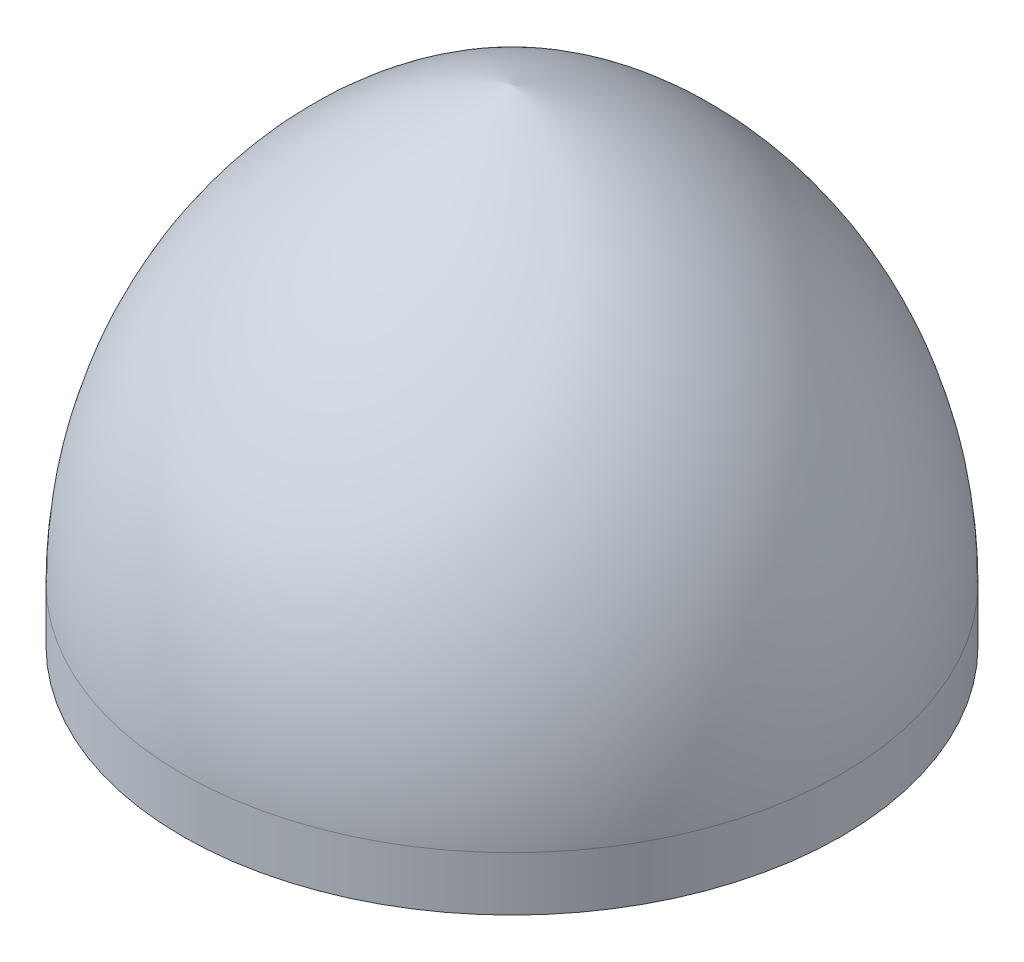
ISO-10303-21;
HEADER;
FILE_DESCRIPTION(('STEP AP214'),'2;1');
FILE_NAME('part.step','',(''),(''),'','','');
FILE_SCHEMA(('AUTOMOTIVE_DESIGN { 1 0 10303 214 1 1 1 1 }'));
ENDSEC;
DATA;
#1=APPLICATION_CONTEXT('core data for automotive mechanical design processes');
#2=APPLICATION_PROTOCOL_DEFINITION('international standard','automotive_design',2000,#1);
#3=PRODUCT_CONTEXT('',#1,'mechanical');
#4=PRODUCT('Part','Part','',(#3));
#5=PRODUCT_RELATED_PRODUCT_CATEGORY('part','',(#4));
#6=PRODUCT_DEFINITION_FORMATION('','',#4);
#7=PRODUCT_DEFINITION_CONTEXT('part definition',#1,'design');
#8=PRODUCT_DEFINITION('design','',#6,#7);
#9=PRODUCT_DEFINITION_SHAPE('','',#8);
#10=(LENGTH_UNIT() NAMED_UNIT(*) SI_UNIT(.MILLI.,.METRE.));
#11=(NAMED_UNIT(*) PLANE_ANGLE_UNIT() SI_UNIT($,.RADIAN.));
#12=(NAMED_UNIT(*) SI_UNIT($,.STERADIAN.) SOLID_ANGLE_UNIT());
#13=UNCERTAINTY_MEASURE_WITH_UNIT(LENGTH_MEASURE(1.E-05),#10,'distance_accuracy_value','');
#14=(GEOMETRIC_REPRESENTATION_CONTEXT(3) GLOBAL_UNCERTAINTY_ASSIGNED_CONTEXT((#13)) GLOBAL_UNIT_ASSIGNED_CONTEXT((#10,
#11,#12)) REPRESENTATION_CONTEXT('',''));
#15=CARTESIAN_POINT('',(0.,0.,0.));
#16=DIRECTION('',(0.,0.,1.));
#17=DIRECTION('',(1.,0.,0.));
#18=AXIS2_PLACEMENT_3D('',#15,#16,#17);
#19=CARTESIAN_POINT('',(0.,0.,0.));
#20=DIRECTION('',(0.,-1.,0.));
#21=DIRECTION('',(0.,0.,-1.));
#22=AXIS2_PLACEMENT_3D('',#19,#20,#21);
#23=CYLINDRICAL_SURFACE('',#22,58.);
#24=DIRECTION('',(0.,1.,0.));
#25=VECTOR('',#24,1.);
#26=CARTESIAN_POINT('',(-57.9205130157653,0.,3.03548546209075));
#27=LINE('',#26,#25);
#28=CARTESIAN_POINT('',(-57.9205130157653,167.,3.03548546209075));
#29=VERTEX_POINT('',#28);
#30=CARTESIAN_POINT('',(-57.9205130157653,170.,3.03548546209075));
#31=VERTEX_POINT('',#30);
#32=EDGE_CURVE('E204',#29,#31,#27,.T.);
#33=ORIENTED_EDGE('',*,*,#32,.T.);
#34=CARTESIAN_POINT('',(0.,170.,0.));
#35=DIRECTION('',(0.,-1.,0.));
#36=DIRECTION('',(0.,0.,-1.));
#37=AXIS2_PLACEMENT_3D('',#34,#35,#36);
#38=CIRCLE('',#37,58.);
#39=CARTESIAN_POINT('',(58.,170.,0.));
#40=VERTEX_POINT('',#39);
#41=EDGE_CURVE('E43',#40,#31,#38,.T.);
#42=ORIENTED_EDGE('',*,*,#41,.F.);
#43=DIRECTION('',(0.,1.,0.));
#44=VECTOR('',#43,1.);
#45=CARTESIAN_POINT('',(58.,0.,0.));
#46=LINE('',#45,#44);
#47=CARTESIAN_POINT('',(58.,167.,0.));
#48=VERTEX_POINT('',#47);
#49=EDGE_CURVE('E214',#48,#40,#46,.T.);
#50=ORIENTED_EDGE('',*,*,#49,.F.);
#51=CARTESIAN_POINT('',(0.,167.,0.));
#52=DIRECTION('',(0.,-1.,0.));
#53=DIRECTION('',(1.,0.,0.));
#54=AXIS2_PLACEMENT_3D('',#51,#52,#53);
#55=CIRCLE('',#54,58.);
#56=CARTESIAN_POINT('',(57.9205130157653,167.,-3.03548546209075));
#57=VERTEX_POINT('',#56);
#58=EDGE_CURVE('E59',#57,#48,#55,.T.);
#59=ORIENTED_EDGE('',*,*,#58,.F.);
#60=DIRECTION('',(0.,1.,0.));
#61=VECTOR('',#60,1.);
#62=CARTESIAN_POINT('',(57.9205130157653,0.,-3.03548546209075));
#63=LINE('',#62,#61);
#64=CARTESIAN_POINT('',(57.9205130157653,170.,-3.03548546209075));
#65=VERTEX_POINT('',#64);
#66=EDGE_CURVE('E221',#57,#65,#63,.T.);
#67=ORIENTED_EDGE('',*,*,#66,.T.);
#68=CARTESIAN_POINT('',(-58.,170.,0.));
#69=VERTEX_POINT('',#68);
#70=EDGE_CURVE('E44',#69,#65,#38,.T.);
#71=ORIENTED_EDGE('',*,*,#70,.F.);
#72=DIRECTION('',(0.,1.,0.));
#73=VECTOR('',#72,1.);
#74=CARTESIAN_POINT('',(-58.,0.,0.));
#75=LINE('',#74,#73);
#76=CARTESIAN_POINT('',(-58.,167.,0.));
#77=VERTEX_POINT('',#76);
#78=EDGE_CURVE('E51',#77,#69,#75,.T.);
#79=ORIENTED_EDGE('',*,*,#78,.F.);
#80=CARTESIAN_POINT('',(0.,167.,0.));
#81=DIRECTION('',(0.,-1.,0.));
#82=DIRECTION('',(1.,0.,0.));
#83=AXIS2_PLACEMENT_3D('',#80,#81,#82);
#84=CIRCLE('',#83,58.);
#85=EDGE_CURVE('E137',#29,#77,#84,.T.);
#86=ORIENTED_EDGE('',*,*,#85,.F.);
#87=EDGE_LOOP('',(#33,#42,#50,#59,#67,#71,#79,#86));
#88=FACE_BOUND('',#87,.T.);
#89=CARTESIAN_POINT('',(0.,160.,0.));
#90=DIRECTION('',(0.,-1.,0.));
#91=DIRECTION('',(0.,0.,-1.));
#92=AXIS2_PLACEMENT_3D('',#89,#90,#91);
#93=CIRCLE('',#92,58.);
#94=CARTESIAN_POINT('',(0.,160.,-58.));
#95=VERTEX_POINT('',#94);
#96=EDGE_CURVE('E234',#95,#95,#93,.T.);
#97=ORIENTED_EDGE('',*,*,#96,.T.);
#98=EDGE_LOOP('',(#97));
#99=FACE_BOUND('',#98,.T.);
#100=ADVANCED_FACE('F35',(#88,#99),#23,.F.);
#101=CARTESIAN_POINT('',(0.,170.,21.9590163934426));
#102=DIRECTION('',(-1.,0.,0.));
#103=DIRECTION('',(0.,0.,-1.));
#104=AXIS2_PLACEMENT_3D('',#101,#102,#103);
#105=CIRCLE('',#104,79.9590163934426);
#106=TRIMMED_CURVE('',#105,(PARAMETER_VALUE(-1.29259310940795)),
(PARAMETER_VALUE(1.29259310940795)),.T.,.PARAMETER.);
#107=CARTESIAN_POINT('',(0.,170.,0.));
#108=DIRECTION('',(0.,-1.,0.));
#109=AXIS1_PLACEMENT('',#107,#108);
#110=SURFACE_OF_REVOLUTION('',#106,#109);
#111=CARTESIAN_POINT('',(0.,246.884627212723,0.));
#112=VERTEX_POINT('',#111);
#113=VERTEX_LOOP('',#112);
#114=FACE_BOUND('',#113,.T.);
#115=EDGE_CURVE('E11',#65,#40,#38,.T.);
#116=ORIENTED_EDGE('',*,*,#115,.T.);
#117=ORIENTED_EDGE('',*,*,#41,.T.);
#118=CARTESIAN_POINT('',(0.,170.,0.));
#119=DIRECTION('',(0.,-1.,0.));
#120=DIRECTION('',(1.,0.,0.));
#121=AXIS2_PLACEMENT_3D('',#118,#119,#120);
#122=CIRCLE('',#121,58.);
#123=EDGE_CURVE('E208',#31,#69,#122,.T.);
#124=ORIENTED_EDGE('',*,*,#123,.T.);
#125=ORIENTED_EDGE('',*,*,#70,.T.);
#126=EDGE_LOOP('',(#116,#117,#124,#125));
#127=FACE_BOUND('',#126,.T.);
#128=ADVANCED_FACE('F37',(#114,#127),#110,.F.);
#129=CARTESIAN_POINT('',(58.,160.,0.));
#130=DIRECTION('',(0.,-1.,0.));
#131=DIRECTION('',(0.,0.,-1.));
#132=AXIS2_PLACEMENT_3D('',#129,#130,#131);
#133=PLANE('',#132);
#134=CARTESIAN_POINT('',(0.,160.,0.));
#135=DIRECTION('',(0.,-1.,0.));
#136=DIRECTION('',(0.,0.,-1.));
#137=AXIS2_PLACEMENT_3D('',#134,#135,#136);
#138=CIRCLE('',#137,61.);
#139=CARTESIAN_POINT('',(0.,160.,-61.));
#140=VERTEX_POINT('',#139);
#141=EDGE_CURVE('E232',#140,#140,#138,.T.);
#142=ORIENTED_EDGE('',*,*,#141,.T.);
#143=EDGE_LOOP('',(#142));
#144=FACE_BOUND('',#143,.T.);
#145=ORIENTED_EDGE('',*,*,#96,.F.);
#146=EDGE_LOOP('',(#145));
#147=FACE_BOUND('',#146,.T.);
#148=ADVANCED_FACE('F281',(#144,#147),#133,.T.);
#149=CARTESIAN_POINT('',(0.,0.,0.));
#150=DIRECTION('',(0.,-1.,0.));
#151=DIRECTION('',(0.,0.,-1.));
#152=AXIS2_PLACEMENT_3D('',#149,#150,#151);
#153=CYLINDRICAL_SURFACE('',#152,61.);
#154=ORIENTED_EDGE('',*,*,#141,.F.);
#155=EDGE_LOOP('',(#154));
#156=FACE_BOUND('',#155,.T.);
#157=CARTESIAN_POINT('',(0.,170.,0.));
#158=DIRECTION('',(0.,-1.,0.));
#159=DIRECTION('',(0.,0.,-1.));
#160=AXIS2_PLACEMENT_3D('',#157,#158,#159);
#161=CIRCLE('',#160,61.);
#162=CARTESIAN_POINT('',(0.,170.,-61.));
#163=VERTEX_POINT('',#162);
#164=EDGE_CURVE('E229',#163,#163,#161,.T.);
#165=ORIENTED_EDGE('',*,*,#164,.T.);
#166=EDGE_LOOP('',(#165));
#167=FACE_BOUND('',#166,.T.);
#168=ADVANCED_FACE('F286',(#156,#167),#153,.T.);
#169=CARTESIAN_POINT('',(0.,170.,21.9590163934426));
#170=DIRECTION('',(-1.,0.,0.));
#171=DIRECTION('',(0.,0.,-1.));
#172=AXIS2_PLACEMENT_3D('',#169,#170,#171);
#173=CIRCLE('',#172,82.9590163934426);
#174=TRIMMED_CURVE('',#173,(PARAMETER_VALUE(-1.30290645490157)),
(PARAMETER_VALUE(1.30290645490157)),.T.,.PARAMETER.);
#175=CARTESIAN_POINT('',(0.,170.,0.));
#176=DIRECTION('',(0.,-1.,0.));
#177=AXIS1_PLACEMENT('',#175,#176);
#178=SURFACE_OF_REVOLUTION('',#174,#177);
#179=CARTESIAN_POINT('',(0.,250.,0.));
#180=VERTEX_POINT('',#179);
#181=VERTEX_LOOP('',#180);
#182=FACE_BOUND('',#181,.T.);
#183=ORIENTED_EDGE('',*,*,#164,.F.);
#184=EDGE_LOOP('',(#183));
#185=FACE_BOUND('',#184,.T.);
#186=ADVANCED_FACE('F290',(#182,#185),#178,.T.);
#187=CARTESIAN_POINT('',(0.,167.,0.));
#188=DIRECTION('',(0.,-1.,0.));
#189=DIRECTION('',(1.,0.,0.));
#190=AXIS2_PLACEMENT_3D('',#187,#188,#189);
#191=PLANE('',#190);
#192=ORIENTED_EDGE('',*,*,#58,.T.);
#193=DIRECTION('',(1.,0.,0.));
#194=VECTOR('',#193,1.);
#195=CARTESIAN_POINT('',(0.,167.,0.));
#196=LINE('',#195,#194);
#197=CARTESIAN_POINT('',(52.,167.,0.));
#198=VERTEX_POINT('',#197);
#199=EDGE_CURVE('E211',#198,#48,#196,.T.);
#200=ORIENTED_EDGE('',*,*,#199,.F.);
#201=CARTESIAN_POINT('',(0.,167.,0.));
#202=DIRECTION('',(0.,-1.,0.));
#203=DIRECTION('',(1.,0.,0.));
#204=AXIS2_PLACEMENT_3D('',#201,#202,#203);
#205=CIRCLE('',#204,52.);
#206=CARTESIAN_POINT('',(51.2100031566348,167.,-9.0297052386804));
#207=VERTEX_POINT('',#206);
#208=EDGE_CURVE('E185',#207,#198,#205,.T.);
#209=ORIENTED_EDGE('',*,*,#208,.F.);
#210=DIRECTION('',(0.984807753012208,0.,-0.173648177666931));
#211=VECTOR('',#210,1.);
#212=CARTESIAN_POINT('',(0.,167.,0.));
#213=LINE('',#212,#211);
#214=CARTESIAN_POINT('',(54.1644264156714,167.,-9.55064977168119));
#215=VERTEX_POINT('',#214);
#216=EDGE_CURVE('E173',#207,#215,#213,.T.);
#217=ORIENTED_EDGE('',*,*,#216,.T.);
#218=CARTESIAN_POINT('',(0.,167.,0.));
#219=DIRECTION('',(0.,-1.,0.));
#220=DIRECTION('',(1.,0.,0.));
#221=AXIS2_PLACEMENT_3D('',#218,#219,#220);
#222=CIRCLE('',#221,55.);
#223=CARTESIAN_POINT('',(54.9246244115016,167.,-2.87847759336192));
#224=VERTEX_POINT('',#223);
#225=EDGE_CURVE('E140',#215,#224,#222,.T.);
#226=ORIENTED_EDGE('',*,*,#225,.T.);
#227=DIRECTION('',(0.998629534754574,0.,-0.0523359562429439));
#228=VECTOR('',#227,1.);
#229=CARTESIAN_POINT('',(0.,167.,0.));
#230=LINE('',#229,#228);
#231=EDGE_CURVE('E219',#224,#57,#230,.T.);
#232=ORIENTED_EDGE('',*,*,#231,.T.);
#233=EDGE_LOOP('',(#192,#200,#209,#217,#226,#232));
#234=FACE_BOUND('',#233,.T.);
#235=ADVANCED_FACE('F257',(#234),#191,.T.);
#236=CARTESIAN_POINT('',(0.,170.,0.));
#237=DIRECTION('',(0.,1.,0.));
#238=DIRECTION('',(-1.,0.,0.));
#239=AXIS2_PLACEMENT_3D('',#236,#237,#238);
#240=PLANE('',#239);
#241=DIRECTION('',(-0.998629534754574,0.,0.0523359562429439));
#242=VECTOR('',#241,1.);
#243=CARTESIAN_POINT('',(0.,170.,0.));
#244=LINE('',#243,#242);
#245=CARTESIAN_POINT('',(54.9246244115016,170.,-2.87847759336192));
#246=VERTEX_POINT('',#245);
#247=EDGE_CURVE('E223',#65,#246,#244,.T.);
#248=ORIENTED_EDGE('',*,*,#247,.T.);
#249=CARTESIAN_POINT('',(0.,170.,0.));
#250=DIRECTION('',(0.,-1.,0.));
#251=DIRECTION('',(1.,0.,0.));
#252=AXIS2_PLACEMENT_3D('',#249,#250,#251);
#253=CIRCLE('',#252,55.);
#254=CARTESIAN_POINT('',(54.1644264156714,170.,-9.55064977168119));
#255=VERTEX_POINT('',#254);
#256=EDGE_CURVE('E191',#255,#246,#253,.T.);
#257=ORIENTED_EDGE('',*,*,#256,.F.);
#258=DIRECTION('',(-0.984807753012208,0.,0.173648177666931));
#259=VECTOR('',#258,1.);
#260=CARTESIAN_POINT('',(0.,170.,0.));
#261=LINE('',#260,#259);
#262=CARTESIAN_POINT('',(51.2100031566348,170.,-9.0297052386804));
#263=VERTEX_POINT('',#262);
#264=EDGE_CURVE('E179',#255,#263,#261,.T.);
#265=ORIENTED_EDGE('',*,*,#264,.T.);
#266=CARTESIAN_POINT('',(0.,170.,0.));
#267=DIRECTION('',(0.,-1.,0.));
#268=DIRECTION('',(1.,0.,0.));
#269=AXIS2_PLACEMENT_3D('',#266,#267,#268);
#270=CIRCLE('',#269,52.);
#271=CARTESIAN_POINT('',(52.,170.,0.));
#272=VERTEX_POINT('',#271);
#273=EDGE_CURVE('E188',#263,#272,#270,.T.);
#274=ORIENTED_EDGE('',*,*,#273,.T.);
#275=DIRECTION('',(-1.,0.,0.));
#276=VECTOR('',#275,1.);
#277=CARTESIAN_POINT('',(0.,170.,0.));
#278=LINE('',#277,#276);
#279=EDGE_CURVE('E217',#40,#272,#278,.T.);
#280=ORIENTED_EDGE('',*,*,#279,.F.);
#281=ORIENTED_EDGE('',*,*,#115,.F.);
#282=EDGE_LOOP('',(#248,#257,#265,#274,#280,#281));
#283=FACE_BOUND('',#282,.T.);
#284=ADVANCED_FACE('F248',(#283),#240,.T.);
#285=CARTESIAN_POINT('',(0.,0.,0.));
#286=DIRECTION('',(0.0523359562429439,0.,0.998629534754574));
#287=DIRECTION('',(0.998629534754574,0.,-0.0523359562429439));
#288=AXIS2_PLACEMENT_3D('',#285,#286,#287);
#289=PLANE('',#288);
#290=ORIENTED_EDGE('',*,*,#231,.F.);
#291=DIRECTION('',(0.,-1.,0.));
#292=VECTOR('',#291,1.);
#293=CARTESIAN_POINT('',(54.9246244115016,0.,-2.87847759336192));
#294=LINE('',#293,#292);
#295=EDGE_CURVE('E226',#246,#224,#294,.T.);
#296=ORIENTED_EDGE('',*,*,#295,.F.);
#297=ORIENTED_EDGE('',*,*,#247,.F.);
#298=ORIENTED_EDGE('',*,*,#66,.F.);
#299=EDGE_LOOP('',(#290,#296,#297,#298));
#300=FACE_BOUND('',#299,.T.);
#301=ADVANCED_FACE('F267',(#300),#289,.F.);
#302=CARTESIAN_POINT('',(0.,0.,0.));
#303=DIRECTION('',(0.,0.,1.));
#304=DIRECTION('',(1.,0.,0.));
#305=AXIS2_PLACEMENT_3D('',#302,#303,#304);
#306=PLANE('',#305);
#307=ORIENTED_EDGE('',*,*,#199,.T.);
#308=ORIENTED_EDGE('',*,*,#49,.T.);
#309=ORIENTED_EDGE('',*,*,#279,.T.);
#310=DIRECTION('',(0.,-1.,0.));
#311=VECTOR('',#310,1.);
#312=CARTESIAN_POINT('',(52.,0.,0.));
#313=LINE('',#312,#311);
#314=EDGE_CURVE('E149',#272,#198,#313,.T.);
#315=ORIENTED_EDGE('',*,*,#314,.T.);
#316=EDGE_LOOP('',(#307,#308,#309,#315));
#317=FACE_BOUND('',#316,.T.);
#318=ADVANCED_FACE('F246',(#317),#306,.T.);
#319=CARTESIAN_POINT('',(0.,167.,0.));
#320=DIRECTION('',(0.,-1.,0.));
#321=DIRECTION('',(1.,0.,0.));
#322=AXIS2_PLACEMENT_3D('',#319,#320,#321);
#323=PLANE('',#322);
#324=DIRECTION('',(-1.,0.,0.));
#325=VECTOR('',#324,1.);
#326=CARTESIAN_POINT('',(0.,167.,0.));
#327=LINE('',#326,#325);
#328=CARTESIAN_POINT('',(-52.,167.,0.));
#329=VERTEX_POINT('',#328);
#330=EDGE_CURVE('E130',#329,#77,#327,.T.);
#331=ORIENTED_EDGE('',*,*,#330,.F.);
#332=CARTESIAN_POINT('',(0.,167.,0.));
#333=DIRECTION('',(0.,-1.,0.));
#334=DIRECTION('',(1.,0.,0.));
#335=AXIS2_PLACEMENT_3D('',#332,#333,#334);
#336=CIRCLE('',#335,52.);
#337=CARTESIAN_POINT('',(-51.2100031566348,167.,9.0297052386804));
#338=VERTEX_POINT('',#337);
#339=EDGE_CURVE('E134',#338,#329,#336,.T.);
#340=ORIENTED_EDGE('',*,*,#339,.F.);
#341=DIRECTION('',(-0.984807753012208,0.,0.173648177666931));
#342=VECTOR('',#341,1.);
#343=CARTESIAN_POINT('',(0.,167.,0.));
#344=LINE('',#343,#342);
#345=CARTESIAN_POINT('',(-54.1644264156715,167.,9.55064977168119));
#346=VERTEX_POINT('',#345);
#347=EDGE_CURVE('E154',#338,#346,#344,.T.);
#348=ORIENTED_EDGE('',*,*,#347,.T.);
#349=CARTESIAN_POINT('',(0.,167.,0.));
#350=DIRECTION('',(0.,-1.,0.));
#351=DIRECTION('',(1.,0.,0.));
#352=AXIS2_PLACEMENT_3D('',#349,#350,#351);
#353=CIRCLE('',#352,55.);
#354=CARTESIAN_POINT('',(-54.9246244115016,167.,2.87847759336192));
#355=VERTEX_POINT('',#354);
#356=EDGE_CURVE('E165',#346,#355,#353,.T.);
#357=ORIENTED_EDGE('',*,*,#356,.T.);
#358=DIRECTION('',(-0.998629534754574,0.,0.0523359562429439));
#359=VECTOR('',#358,1.);
#360=CARTESIAN_POINT('',(0.,167.,0.));
#361=LINE('',#360,#359);
#362=EDGE_CURVE('E197',#355,#29,#361,.T.);
#363=ORIENTED_EDGE('',*,*,#362,.T.);
#364=ORIENTED_EDGE('',*,*,#85,.T.);
#365=EDGE_LOOP('',(#331,#340,#348,#357,#363,#364));
#366=FACE_BOUND('',#365,.T.);
#367=ADVANCED_FACE('F132',(#366),#323,.T.);
#368=CARTESIAN_POINT('',(0.,170.,0.));
#369=DIRECTION('',(0.,1.,0.));
#370=DIRECTION('',(-1.,0.,0.));
#371=AXIS2_PLACEMENT_3D('',#368,#369,#370);
#372=PLANE('',#371);
#373=ORIENTED_EDGE('',*,*,#123,.F.);
#374=DIRECTION('',(0.998629534754574,0.,-0.0523359562429439));
#375=VECTOR('',#374,1.);
#376=CARTESIAN_POINT('',(0.,170.,0.));
#377=LINE('',#376,#375);
#378=CARTESIAN_POINT('',(-54.9246244115016,170.,2.87847759336192));
#379=VERTEX_POINT('',#378);
#380=EDGE_CURVE('E201',#31,#379,#377,.T.);
#381=ORIENTED_EDGE('',*,*,#380,.T.);
#382=CARTESIAN_POINT('',(0.,170.,0.));
#383=DIRECTION('',(0.,-1.,0.));
#384=DIRECTION('',(1.,0.,0.));
#385=AXIS2_PLACEMENT_3D('',#382,#383,#384);
#386=CIRCLE('',#385,55.);
#387=CARTESIAN_POINT('',(-54.1644264156715,170.,9.55064977168119));
#388=VERTEX_POINT('',#387);
#389=EDGE_CURVE('E168',#388,#379,#386,.T.);
#390=ORIENTED_EDGE('',*,*,#389,.F.);
#391=DIRECTION('',(0.984807753012208,0.,-0.173648177666931));
#392=VECTOR('',#391,1.);
#393=CARTESIAN_POINT('',(0.,170.,0.));
#394=LINE('',#393,#392);
#395=CARTESIAN_POINT('',(-51.2100031566348,170.,9.0297052386804));
#396=VERTEX_POINT('',#395);
#397=EDGE_CURVE('E159',#388,#396,#394,.T.);
#398=ORIENTED_EDGE('',*,*,#397,.T.);
#399=CARTESIAN_POINT('',(0.,170.,0.));
#400=DIRECTION('',(0.,-1.,0.));
#401=DIRECTION('',(1.,0.,0.));
#402=AXIS2_PLACEMENT_3D('',#399,#400,#401);
#403=CIRCLE('',#402,52.);
#404=CARTESIAN_POINT('',(-52.,170.,0.));
#405=VERTEX_POINT('',#404);
#406=EDGE_CURVE('E150',#396,#405,#403,.T.);
#407=ORIENTED_EDGE('',*,*,#406,.T.);
#408=DIRECTION('',(1.,0.,0.));
#409=VECTOR('',#408,1.);
#410=CARTESIAN_POINT('',(0.,170.,0.));
#411=LINE('',#410,#409);
#412=EDGE_CURVE('E139',#69,#405,#411,.T.);
#413=ORIENTED_EDGE('',*,*,#412,.F.);
#414=EDGE_LOOP('',(#373,#381,#390,#398,#407,#413));
#415=FACE_BOUND('',#414,.T.);
#416=ADVANCED_FACE('F325',(#415),#372,.T.);
#417=CARTESIAN_POINT('',(0.,0.,0.));
#418=DIRECTION('',(0.0523359562429439,0.,0.998629534754574));
#419=DIRECTION('',(0.998629534754574,0.,-0.0523359562429439));
#420=AXIS2_PLACEMENT_3D('',#417,#418,#419);
#421=PLANE('',#420);
#422=ORIENTED_EDGE('',*,*,#362,.F.);
#423=DIRECTION('',(0.,-1.,0.));
#424=VECTOR('',#423,1.);
#425=CARTESIAN_POINT('',(-54.9246244115016,0.,2.87847759336192));
#426=LINE('',#425,#424);
#427=EDGE_CURVE('E199',#379,#355,#426,.T.);
#428=ORIENTED_EDGE('',*,*,#427,.F.);
#429=ORIENTED_EDGE('',*,*,#380,.F.);
#430=ORIENTED_EDGE('',*,*,#32,.F.);
#431=EDGE_LOOP('',(#422,#428,#429,#430));
#432=FACE_BOUND('',#431,.T.);
#433=ADVANCED_FACE('F335',(#432),#421,.T.);
#434=CARTESIAN_POINT('',(0.,0.,0.));
#435=DIRECTION('',(0.,0.,1.));
#436=DIRECTION('',(1.,0.,0.));
#437=AXIS2_PLACEMENT_3D('',#434,#435,#436);
#438=PLANE('',#437);
#439=ORIENTED_EDGE('',*,*,#330,.T.);
#440=ORIENTED_EDGE('',*,*,#78,.T.);
#441=ORIENTED_EDGE('',*,*,#412,.T.);
#442=DIRECTION('',(0.,-1.,0.));
#443=VECTOR('',#442,1.);
#444=CARTESIAN_POINT('',(-52.,0.,0.));
#445=LINE('',#444,#443);
#446=EDGE_CURVE('E146',#405,#329,#445,.T.);
#447=ORIENTED_EDGE('',*,*,#446,.T.);
#448=EDGE_LOOP('',(#439,#440,#441,#447));
#449=FACE_BOUND('',#448,.T.);
#450=ADVANCED_FACE('F152',(#449),#438,.F.);
#451=CARTESIAN_POINT('',(0.,250.,0.));
#452=DIRECTION('',(0.,-1.,0.));
#453=DIRECTION('',(1.,0.,0.));
#454=AXIS2_PLACEMENT_3D('',#451,#452,#453);
#455=CYLINDRICAL_SURFACE('',#454,55.);
#456=ORIENTED_EDGE('',*,*,#295,.T.);
#457=ORIENTED_EDGE('',*,*,#225,.F.);
#458=DIRECTION('',(0.,1.,0.));
#459=VECTOR('',#458,1.);
#460=CARTESIAN_POINT('',(54.1644264156714,0.,-9.5506497716812));
#461=LINE('',#460,#459);
#462=EDGE_CURVE('E176',#215,#255,#461,.T.);
#463=ORIENTED_EDGE('',*,*,#462,.T.);
#464=ORIENTED_EDGE('',*,*,#256,.T.);
#465=EDGE_LOOP('',(#456,#457,#463,#464));
#466=FACE_BOUND('',#465,.T.);
#467=ADVANCED_FACE('F262',(#466),#455,.T.);
#468=CARTESIAN_POINT('',(0.,250.,0.));
#469=DIRECTION('',(0.,-1.,0.));
#470=DIRECTION('',(1.,0.,0.));
#471=AXIS2_PLACEMENT_3D('',#468,#469,#470);
#472=CYLINDRICAL_SURFACE('',#471,52.);
#473=DIRECTION('',(0.,-1.,0.));
#474=VECTOR('',#473,1.);
#475=CARTESIAN_POINT('',(51.2100031566348,0.,-9.02970523868041));
#476=LINE('',#475,#474);
#477=EDGE_CURVE('E182',#263,#207,#476,.T.);
#478=ORIENTED_EDGE('',*,*,#477,.T.);
#479=ORIENTED_EDGE('',*,*,#208,.T.);
#480=ORIENTED_EDGE('',*,*,#314,.F.);
#481=ORIENTED_EDGE('',*,*,#273,.F.);
#482=EDGE_LOOP('',(#478,#479,#480,#481));
#483=FACE_BOUND('',#482,.T.);
#484=ADVANCED_FACE('F254',(#483),#472,.F.);
#485=CARTESIAN_POINT('',(0.,0.,0.));
#486=DIRECTION('',(0.173648177666931,0.,0.984807753012208));
#487=DIRECTION('',(0.984807753012208,0.,-0.173648177666931));
#488=AXIS2_PLACEMENT_3D('',#485,#486,#487);
#489=PLANE('',#488);
#490=ORIENTED_EDGE('',*,*,#216,.F.);
#491=ORIENTED_EDGE('',*,*,#477,.F.);
#492=ORIENTED_EDGE('',*,*,#264,.F.);
#493=ORIENTED_EDGE('',*,*,#462,.F.);
#494=EDGE_LOOP('',(#490,#491,#492,#493));
#495=FACE_BOUND('',#494,.T.);
#496=ADVANCED_FACE('F260',(#495),#489,.F.);
#497=CARTESIAN_POINT('',(0.,250.,0.));
#498=DIRECTION('',(0.,-1.,0.));
#499=DIRECTION('',(1.,0.,0.));
#500=AXIS2_PLACEMENT_3D('',#497,#498,#499);
#501=CYLINDRICAL_SURFACE('',#500,52.);
#502=ORIENTED_EDGE('',*,*,#406,.F.);
#503=DIRECTION('',(0.,-1.,0.));
#504=VECTOR('',#503,1.);
#505=CARTESIAN_POINT('',(-51.2100031566348,0.,9.0297052386804));
#506=LINE('',#505,#504);
#507=EDGE_CURVE('E148',#396,#338,#506,.T.);
#508=ORIENTED_EDGE('',*,*,#507,.T.);
#509=ORIENTED_EDGE('',*,*,#339,.T.);
#510=ORIENTED_EDGE('',*,*,#446,.F.);
#511=EDGE_LOOP('',(#502,#508,#509,#510));
#512=FACE_BOUND('',#511,.T.);
#513=ADVANCED_FACE('F145',(#512),#501,.F.);
#514=CARTESIAN_POINT('',(0.,250.,0.));
#515=DIRECTION('',(0.,-1.,0.));
#516=DIRECTION('',(1.,0.,0.));
#517=AXIS2_PLACEMENT_3D('',#514,#515,#516);
#518=CYLINDRICAL_SURFACE('',#517,55.);
#519=ORIENTED_EDGE('',*,*,#389,.T.);
#520=ORIENTED_EDGE('',*,*,#427,.T.);
#521=ORIENTED_EDGE('',*,*,#356,.F.);
#522=DIRECTION('',(0.,1.,0.));
#523=VECTOR('',#522,1.);
#524=CARTESIAN_POINT('',(-54.1644264156715,0.,9.55064977168119));
#525=LINE('',#524,#523);
#526=EDGE_CURVE('E162',#346,#388,#525,.T.);
#527=ORIENTED_EDGE('',*,*,#526,.T.);
#528=EDGE_LOOP('',(#519,#520,#521,#527));
#529=FACE_BOUND('',#528,.T.);
#530=ADVANCED_FACE('F388',(#529),#518,.T.);
#531=CARTESIAN_POINT('',(0.,0.,0.));
#532=DIRECTION('',(0.173648177666931,0.,0.984807753012208));
#533=DIRECTION('',(0.984807753012208,0.,-0.173648177666931));
#534=AXIS2_PLACEMENT_3D('',#531,#532,#533);
#535=PLANE('',#534);
#536=ORIENTED_EDGE('',*,*,#347,.F.);
#537=ORIENTED_EDGE('',*,*,#507,.F.);
#538=ORIENTED_EDGE('',*,*,#397,.F.);
#539=ORIENTED_EDGE('',*,*,#526,.F.);
#540=EDGE_LOOP('',(#536,#537,#538,#539));
#541=FACE_BOUND('',#540,.T.);
#542=ADVANCED_FACE('F397',(#541),#535,.T.);
#543=CLOSED_SHELL('',(#100,#128,#148,#168,#186,#235,#284,#301,#318,#367,#416,#433,#450,#467,
#484,#496,#513,#530,#542));
#544=MANIFOLD_SOLID_BREP('B2',#543);
#545=ADVANCED_BREP_SHAPE_REPRESENTATION('',(#18,#544),#14);
#546=SHAPE_DEFINITION_REPRESENTATION(#9,#545);
ENDSEC;
END-ISO-10303-21;
